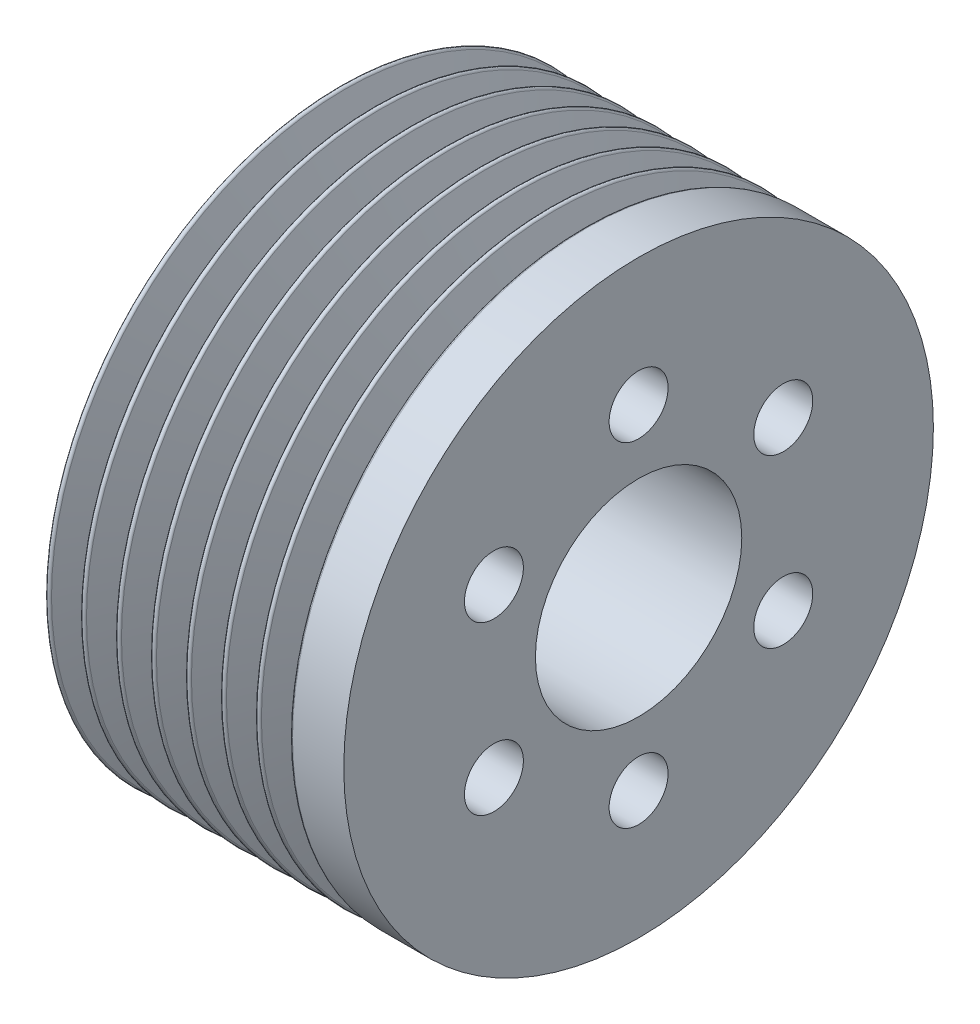
ISO-10303-21;
HEADER;
FILE_DESCRIPTION(('STEP AP214'),'2;1');
FILE_NAME('part.step','',(''),(''),'','','');
FILE_SCHEMA(('AUTOMOTIVE_DESIGN { 1 0 10303 214 1 1 1 1 }'));
ENDSEC;
DATA;
#1=APPLICATION_CONTEXT('core data for automotive mechanical design processes');
#2=APPLICATION_PROTOCOL_DEFINITION('international standard','automotive_design',2000,#1);
#3=PRODUCT_CONTEXT('',#1,'mechanical');
#4=PRODUCT('Part','Part','',(#3));
#5=PRODUCT_RELATED_PRODUCT_CATEGORY('part','',(#4));
#6=PRODUCT_DEFINITION_FORMATION('','',#4);
#7=PRODUCT_DEFINITION_CONTEXT('part definition',#1,'design');
#8=PRODUCT_DEFINITION('design','',#6,#7);
#9=PRODUCT_DEFINITION_SHAPE('','',#8);
#10=(LENGTH_UNIT() NAMED_UNIT(*) SI_UNIT(.MILLI.,.METRE.));
#11=(NAMED_UNIT(*) PLANE_ANGLE_UNIT() SI_UNIT($,.RADIAN.));
#12=(NAMED_UNIT(*) SI_UNIT($,.STERADIAN.) SOLID_ANGLE_UNIT());
#13=UNCERTAINTY_MEASURE_WITH_UNIT(LENGTH_MEASURE(1.E-05),#10,'distance_accuracy_value','');
#14=(GEOMETRIC_REPRESENTATION_CONTEXT(3) GLOBAL_UNCERTAINTY_ASSIGNED_CONTEXT((#13)) GLOBAL_UNIT_ASSIGNED_CONTEXT((#10,
#11,#12)) REPRESENTATION_CONTEXT('',''));
#15=CARTESIAN_POINT('',(0.,0.,0.));
#16=DIRECTION('',(0.,0.,1.));
#17=DIRECTION('',(1.,0.,0.));
#18=AXIS2_PLACEMENT_3D('',#15,#16,#17);
#19=CARTESIAN_POINT('',(18.,30.,0.));
#20=DIRECTION('',(1.,0.,0.));
#21=DIRECTION('',(0.,0.,-1.));
#22=AXIS2_PLACEMENT_3D('',#19,#20,#21);
#23=PLANE('',#22);
#24=CARTESIAN_POINT('',(18.,0.,0.));
#25=DIRECTION('',(-1.,0.,0.));
#26=DIRECTION('',(0.,0.,1.));
#27=AXIS2_PLACEMENT_3D('',#24,#25,#26);
#28=CIRCLE('',#27,21.5);
#29=CARTESIAN_POINT('',(18.,0.,21.5));
#30=VERTEX_POINT('',#29);
#31=EDGE_CURVE('E48',#30,#30,#28,.T.);
#32=ORIENTED_EDGE('',*,*,#31,.F.);
#33=EDGE_LOOP('',(#32));
#34=FACE_BOUND('',#33,.T.);
#35=CARTESIAN_POINT('',(18.,0.,0.));
#36=DIRECTION('',(1.,0.,0.));
#37=DIRECTION('',(0.,0.,-1.));
#38=AXIS2_PLACEMENT_3D('',#35,#36,#37);
#39=CIRCLE('',#38,28.1636882530696);
#40=CARTESIAN_POINT('',(18.,0.,-28.1636882530696));
#41=VERTEX_POINT('',#40);
#42=EDGE_CURVE('E44',#41,#41,#39,.T.);
#43=ORIENTED_EDGE('',*,*,#42,.F.);
#44=EDGE_LOOP('',(#43));
#45=FACE_BOUND('',#44,.T.);
#46=ADVANCED_FACE('F40',(#34,#45),#23,.F.);
#47=CARTESIAN_POINT('',(31.5,10.5,0.));
#48=DIRECTION('',(1.,0.,0.));
#49=DIRECTION('',(0.,0.,-1.));
#50=AXIS2_PLACEMENT_3D('',#47,#48,#49);
#51=PLANE('',#50);
#52=CARTESIAN_POINT('',(31.5,8.50000000000017,14.7224318643354));
#53=DIRECTION('',(1.,0.,0.));
#54=DIRECTION('',(0.,0.,-1.));
#55=AXIS2_PLACEMENT_3D('',#52,#53,#54);
#56=CIRCLE('',#55,3.);
#57=CARTESIAN_POINT('',(31.5,8.50000000000017,11.7224318643354));
#58=VERTEX_POINT('',#57);
#59=EDGE_CURVE('E183',#58,#58,#56,.F.);
#60=ORIENTED_EDGE('',*,*,#59,.F.);
#61=EDGE_LOOP('',(#60));
#62=FACE_BOUND('',#61,.T.);
#63=CARTESIAN_POINT('',(31.5,-8.50000000000004,14.7224318643355));
#64=DIRECTION('',(1.,0.,0.));
#65=DIRECTION('',(0.,0.,-1.));
#66=AXIS2_PLACEMENT_3D('',#63,#64,#65);
#67=CIRCLE('',#66,3.);
#68=CARTESIAN_POINT('',(31.5,-8.50000000000004,11.7224318643355));
#69=VERTEX_POINT('',#68);
#70=EDGE_CURVE('E177',#69,#69,#67,.F.);
#71=ORIENTED_EDGE('',*,*,#70,.F.);
#72=EDGE_LOOP('',(#71));
#73=FACE_BOUND('',#72,.T.);
#74=CARTESIAN_POINT('',(31.5,-17.0000000000001,0.));
#75=DIRECTION('',(1.,0.,0.));
#76=DIRECTION('',(0.,0.,-1.));
#77=AXIS2_PLACEMENT_3D('',#74,#75,#76);
#78=CIRCLE('',#77,3.);
#79=CARTESIAN_POINT('',(31.5,-17.0000000000001,-2.99999999999996));
#80=VERTEX_POINT('',#79);
#81=EDGE_CURVE('E171',#80,#80,#78,.F.);
#82=ORIENTED_EDGE('',*,*,#81,.F.);
#83=EDGE_LOOP('',(#82));
#84=FACE_BOUND('',#83,.T.);
#85=CARTESIAN_POINT('',(31.5,-8.49999999999999,-14.7224318643355));
#86=DIRECTION('',(1.,0.,0.));
#87=DIRECTION('',(0.,0.,-1.));
#88=AXIS2_PLACEMENT_3D('',#85,#86,#87);
#89=CIRCLE('',#88,3.);
#90=CARTESIAN_POINT('',(31.5,-8.49999999999999,-17.7224318643355));
#91=VERTEX_POINT('',#90);
#92=EDGE_CURVE('E165',#91,#91,#89,.F.);
#93=ORIENTED_EDGE('',*,*,#92,.F.);
#94=EDGE_LOOP('',(#93));
#95=FACE_BOUND('',#94,.T.);
#96=CARTESIAN_POINT('',(31.5,8.5,-14.7224318643355));
#97=DIRECTION('',(1.,0.,0.));
#98=DIRECTION('',(0.,0.,-1.));
#99=AXIS2_PLACEMENT_3D('',#96,#97,#98);
#100=CIRCLE('',#99,3.);
#101=CARTESIAN_POINT('',(31.5,8.5,-17.7224318643355));
#102=VERTEX_POINT('',#101);
#103=EDGE_CURVE('E159',#102,#102,#100,.F.);
#104=ORIENTED_EDGE('',*,*,#103,.F.);
#105=EDGE_LOOP('',(#104));
#106=FACE_BOUND('',#105,.T.);
#107=CARTESIAN_POINT('',(31.5,17.,0.));
#108=DIRECTION('',(1.,0.,0.));
#109=DIRECTION('',(0.,0.,-1.));
#110=AXIS2_PLACEMENT_3D('',#107,#108,#109);
#111=CIRCLE('',#110,3.);
#112=CARTESIAN_POINT('',(31.5,17.,-3.));
#113=VERTEX_POINT('',#112);
#114=EDGE_CURVE('E153',#113,#113,#111,.F.);
#115=ORIENTED_EDGE('',*,*,#114,.F.);
#116=EDGE_LOOP('',(#115));
#117=FACE_BOUND('',#116,.T.);
#118=CARTESIAN_POINT('',(31.5,0.,0.));
#119=DIRECTION('',(-1.,0.,0.));
#120=DIRECTION('',(0.,0.,1.));
#121=AXIS2_PLACEMENT_3D('',#118,#119,#120);
#122=CIRCLE('',#121,10.5);
#123=CARTESIAN_POINT('',(31.5,0.,10.5));
#124=VERTEX_POINT('',#123);
#125=EDGE_CURVE('E60',#124,#124,#122,.T.);
#126=ORIENTED_EDGE('',*,*,#125,.F.);
#127=EDGE_LOOP('',(#126));
#128=FACE_BOUND('',#127,.T.);
#129=CARTESIAN_POINT('',(31.5,0.,0.));
#130=DIRECTION('',(-1.,0.,0.));
#131=DIRECTION('',(0.,0.,1.));
#132=AXIS2_PLACEMENT_3D('',#129,#130,#131);
#133=CIRCLE('',#132,21.5);
#134=CARTESIAN_POINT('',(31.5,0.,21.5));
#135=VERTEX_POINT('',#134);
#136=EDGE_CURVE('E10',#135,#135,#133,.T.);
#137=ORIENTED_EDGE('',*,*,#136,.T.);
#138=EDGE_LOOP('',(#137));
#139=FACE_BOUND('',#138,.T.);
#140=ADVANCED_FACE('F42',(#62,#73,#84,#95,#106,#117,#128,#139),#51,.F.);
#141=CARTESIAN_POINT('',(0.,0.,0.));
#142=DIRECTION('',(-1.,0.,0.));
#143=DIRECTION('',(0.,0.,1.));
#144=AXIS2_PLACEMENT_3D('',#141,#142,#143);
#145=CYLINDRICAL_SURFACE('',#144,21.5);
#146=ORIENTED_EDGE('',*,*,#136,.F.);
#147=EDGE_LOOP('',(#146));
#148=FACE_BOUND('',#147,.T.);
#149=ORIENTED_EDGE('',*,*,#31,.T.);
#150=EDGE_LOOP('',(#149));
#151=FACE_BOUND('',#150,.T.);
#152=ADVANCED_FACE('F219',(#148,#151),#145,.F.);
#153=CARTESIAN_POINT('',(0.,0.,0.));
#154=DIRECTION('',(-1.,0.,0.));
#155=DIRECTION('',(0.,0.,1.));
#156=AXIS2_PLACEMENT_3D('',#153,#154,#155);
#157=CYLINDRICAL_SURFACE('',#156,30.);
#158=CARTESIAN_POINT('',(43.78,0.,0.));
#159=DIRECTION('',(-1.,0.,0.));
#160=DIRECTION('',(0.,0.,1.));
#161=AXIS2_PLACEMENT_3D('',#158,#159,#160);
#162=CIRCLE('',#161,30.);
#163=CARTESIAN_POINT('',(43.78,0.,30.));
#164=VERTEX_POINT('',#163);
#165=EDGE_CURVE('E75',#164,#164,#162,.T.);
#166=ORIENTED_EDGE('',*,*,#165,.F.);
#167=EDGE_LOOP('',(#166));
#168=FACE_BOUND('',#167,.T.);
#169=CARTESIAN_POINT('',(49.,0.,0.));
#170=DIRECTION('',(-1.,0.,0.));
#171=DIRECTION('',(0.,0.,1.));
#172=AXIS2_PLACEMENT_3D('',#169,#170,#171);
#173=CIRCLE('',#172,30.);
#174=CARTESIAN_POINT('',(49.,0.,30.));
#175=VERTEX_POINT('',#174);
#176=EDGE_CURVE('E52',#175,#175,#173,.T.);
#177=ORIENTED_EDGE('',*,*,#176,.T.);
#178=EDGE_LOOP('',(#177));
#179=FACE_BOUND('',#178,.T.);
#180=ADVANCED_FACE('F196',(#168,#179),#157,.T.);
#181=CARTESIAN_POINT('',(49.,10.5,0.));
#182=DIRECTION('',(-1.,0.,0.));
#183=DIRECTION('',(0.,0.,1.));
#184=AXIS2_PLACEMENT_3D('',#181,#182,#183);
#185=PLANE('',#184);
#186=CARTESIAN_POINT('',(49.,8.50000000000017,14.7224318643354));
#187=DIRECTION('',(1.,0.,0.));
#188=DIRECTION('',(0.,0.,-1.));
#189=AXIS2_PLACEMENT_3D('',#186,#187,#188);
#190=CIRCLE('',#189,3.);
#191=CARTESIAN_POINT('',(49.,8.50000000000017,11.7224318643354));
#192=VERTEX_POINT('',#191);
#193=EDGE_CURVE('E186',#192,#192,#190,.T.);
#194=ORIENTED_EDGE('',*,*,#193,.F.);
#195=EDGE_LOOP('',(#194));
#196=FACE_BOUND('',#195,.T.);
#197=CARTESIAN_POINT('',(49.,-8.50000000000004,14.7224318643355));
#198=DIRECTION('',(1.,0.,0.));
#199=DIRECTION('',(0.,0.,-1.));
#200=AXIS2_PLACEMENT_3D('',#197,#198,#199);
#201=CIRCLE('',#200,3.);
#202=CARTESIAN_POINT('',(49.,-8.50000000000004,11.7224318643355));
#203=VERTEX_POINT('',#202);
#204=EDGE_CURVE('E180',#203,#203,#201,.T.);
#205=ORIENTED_EDGE('',*,*,#204,.F.);
#206=EDGE_LOOP('',(#205));
#207=FACE_BOUND('',#206,.T.);
#208=CARTESIAN_POINT('',(49.,-17.0000000000001,0.));
#209=DIRECTION('',(1.,0.,0.));
#210=DIRECTION('',(0.,0.,-1.));
#211=AXIS2_PLACEMENT_3D('',#208,#209,#210);
#212=CIRCLE('',#211,3.);
#213=CARTESIAN_POINT('',(49.,-17.0000000000001,-2.99999999999996));
#214=VERTEX_POINT('',#213);
#215=EDGE_CURVE('E174',#214,#214,#212,.T.);
#216=ORIENTED_EDGE('',*,*,#215,.F.);
#217=EDGE_LOOP('',(#216));
#218=FACE_BOUND('',#217,.T.);
#219=CARTESIAN_POINT('',(49.,-8.49999999999999,-14.7224318643355));
#220=DIRECTION('',(1.,0.,0.));
#221=DIRECTION('',(0.,0.,-1.));
#222=AXIS2_PLACEMENT_3D('',#219,#220,#221);
#223=CIRCLE('',#222,3.);
#224=CARTESIAN_POINT('',(49.,-8.49999999999999,-17.7224318643355));
#225=VERTEX_POINT('',#224);
#226=EDGE_CURVE('E168',#225,#225,#223,.T.);
#227=ORIENTED_EDGE('',*,*,#226,.F.);
#228=EDGE_LOOP('',(#227));
#229=FACE_BOUND('',#228,.T.);
#230=CARTESIAN_POINT('',(49.,8.5,-14.7224318643355));
#231=DIRECTION('',(1.,0.,0.));
#232=DIRECTION('',(0.,0.,-1.));
#233=AXIS2_PLACEMENT_3D('',#230,#231,#232);
#234=CIRCLE('',#233,3.);
#235=CARTESIAN_POINT('',(49.,8.5,-17.7224318643355));
#236=VERTEX_POINT('',#235);
#237=EDGE_CURVE('E162',#236,#236,#234,.T.);
#238=ORIENTED_EDGE('',*,*,#237,.F.);
#239=EDGE_LOOP('',(#238));
#240=FACE_BOUND('',#239,.T.);
#241=CARTESIAN_POINT('',(49.,17.,0.));
#242=DIRECTION('',(1.,0.,0.));
#243=DIRECTION('',(0.,0.,-1.));
#244=AXIS2_PLACEMENT_3D('',#241,#242,#243);
#245=CIRCLE('',#244,3.);
#246=CARTESIAN_POINT('',(49.,17.,-3.));
#247=VERTEX_POINT('',#246);
#248=EDGE_CURVE('E156',#247,#247,#245,.T.);
#249=ORIENTED_EDGE('',*,*,#248,.F.);
#250=EDGE_LOOP('',(#249));
#251=FACE_BOUND('',#250,.T.);
#252=ORIENTED_EDGE('',*,*,#176,.F.);
#253=EDGE_LOOP('',(#252));
#254=FACE_BOUND('',#253,.T.);
#255=CARTESIAN_POINT('',(49.,0.,0.));
#256=DIRECTION('',(-1.,0.,0.));
#257=DIRECTION('',(0.,0.,1.));
#258=AXIS2_PLACEMENT_3D('',#255,#256,#257);
#259=CIRCLE('',#258,10.5);
#260=CARTESIAN_POINT('',(49.,0.,10.5));
#261=VERTEX_POINT('',#260);
#262=EDGE_CURVE('E57',#261,#261,#259,.T.);
#263=ORIENTED_EDGE('',*,*,#262,.T.);
#264=EDGE_LOOP('',(#263));
#265=FACE_BOUND('',#264,.T.);
#266=ADVANCED_FACE('F192',(#196,#207,#218,#229,#240,#251,#254,#265),#185,.F.);
#267=CARTESIAN_POINT('',(0.,0.,0.));
#268=DIRECTION('',(-1.,0.,0.));
#269=DIRECTION('',(0.,0.,1.));
#270=AXIS2_PLACEMENT_3D('',#267,#268,#269);
#271=CYLINDRICAL_SURFACE('',#270,10.5);
#272=ORIENTED_EDGE('',*,*,#262,.F.);
#273=EDGE_LOOP('',(#272));
#274=FACE_BOUND('',#273,.T.);
#275=ORIENTED_EDGE('',*,*,#125,.T.);
#276=EDGE_LOOP('',(#275));
#277=FACE_BOUND('',#276,.T.);
#278=ADVANCED_FACE('F195',(#274,#277),#271,.F.);
#279=CARTESIAN_POINT('',(43.78,0.,0.));
#280=DIRECTION('',(-1.,0.,0.));
#281=DIRECTION('',(0.,0.,1.));
#282=AXIS2_PLACEMENT_3D('',#279,#280,#281);
#283=TOROIDAL_SURFACE('',#282,29.75,0.249999999999997);
#284=ORIENTED_EDGE('',*,*,#165,.T.);
#285=EDGE_LOOP('',(#284));
#286=FACE_BOUND('',#285,.T.);
#287=CARTESIAN_POINT('',(43.5458319526879,0.,0.));
#288=DIRECTION('',(-1.,0.,0.));
#289=DIRECTION('',(0.,0.,1.));
#290=AXIS2_PLACEMENT_3D('',#287,#288,#289);
#291=CIRCLE('',#290,29.8375518453149);
#292=CARTESIAN_POINT('',(43.5458319526879,0.,29.8375518453149));
#293=VERTEX_POINT('',#292);
#294=EDGE_CURVE('E63',#293,#293,#291,.T.);
#295=ORIENTED_EDGE('',*,*,#294,.F.);
#296=EDGE_LOOP('',(#295));
#297=FACE_BOUND('',#296,.T.);
#298=ADVANCED_FACE('F214',(#286,#297),#283,.T.);
#299=CARTESIAN_POINT('',(42.2810016567745,0.,0.));
#300=DIRECTION('',(1.,0.,0.));
#301=DIRECTION('',(0.,0.,-1.));
#302=AXIS2_PLACEMENT_3D('',#299,#300,#301);
#303=CONICAL_SURFACE('',#302,26.4546095496951,1.21300383013606);
#304=ORIENTED_EDGE('',*,*,#294,.T.);
#305=EDGE_LOOP('',(#304));
#306=FACE_BOUND('',#305,.T.);
#307=CARTESIAN_POINT('',(42.2810016567745,0.,0.));
#308=DIRECTION('',(-1.,0.,0.));
#309=DIRECTION('',(0.,0.,1.));
#310=AXIS2_PLACEMENT_3D('',#307,#308,#309);
#311=CIRCLE('',#310,26.4546095496951);
#312=CARTESIAN_POINT('',(42.2810016567745,0.,26.4546095496951));
#313=VERTEX_POINT('',#312);
#314=EDGE_CURVE('E66',#313,#313,#311,.T.);
#315=ORIENTED_EDGE('',*,*,#314,.F.);
#316=EDGE_LOOP('',(#315));
#317=FACE_BOUND('',#316,.T.);
#318=ADVANCED_FACE('F364',(#306,#317),#303,.T.);
#319=CARTESIAN_POINT('',(42.,0.,0.));
#320=DIRECTION('',(-1.,0.,0.));
#321=DIRECTION('',(0.,0.,1.));
#322=AXIS2_PLACEMENT_3D('',#319,#320,#321);
#323=TOROIDAL_SURFACE('',#322,26.5596717640729,0.300000000000001);
#324=ORIENTED_EDGE('',*,*,#314,.T.);
#325=EDGE_LOOP('',(#324));
#326=FACE_BOUND('',#325,.T.);
#327=CARTESIAN_POINT('',(41.7189983432255,0.,0.));
#328=DIRECTION('',(-1.,0.,0.));
#329=DIRECTION('',(0.,0.,1.));
#330=AXIS2_PLACEMENT_3D('',#327,#328,#329);
#331=CIRCLE('',#330,26.4546095496951);
#332=CARTESIAN_POINT('',(41.7189983432255,0.,26.4546095496951));
#333=VERTEX_POINT('',#332);
#334=EDGE_CURVE('E69',#333,#333,#331,.T.);
#335=ORIENTED_EDGE('',*,*,#334,.F.);
#336=EDGE_LOOP('',(#335));
#337=FACE_BOUND('',#336,.T.);
#338=ADVANCED_FACE('F360',(#326,#337),#323,.F.);
#339=CARTESIAN_POINT('',(40.4541680473121,0.,0.));
#340=DIRECTION('',(-1.,0.,0.));
#341=DIRECTION('',(0.,0.,1.));
#342=AXIS2_PLACEMENT_3D('',#339,#340,#341);
#343=CONICAL_SURFACE('',#342,29.8375518453149,1.21300383013606);
#344=ORIENTED_EDGE('',*,*,#334,.T.);
#345=EDGE_LOOP('',(#344));
#346=FACE_BOUND('',#345,.T.);
#347=CARTESIAN_POINT('',(40.4541680473121,0.,0.));
#348=DIRECTION('',(-1.,0.,0.));
#349=DIRECTION('',(0.,0.,1.));
#350=AXIS2_PLACEMENT_3D('',#347,#348,#349);
#351=CIRCLE('',#350,29.8375518453149);
#352=CARTESIAN_POINT('',(40.4541680473121,0.,29.8375518453149));
#353=VERTEX_POINT('',#352);
#354=EDGE_CURVE('E72',#353,#353,#351,.T.);
#355=ORIENTED_EDGE('',*,*,#354,.F.);
#356=EDGE_LOOP('',(#355));
#357=FACE_BOUND('',#356,.T.);
#358=ADVANCED_FACE('F356',(#346,#357),#343,.T.);
#359=CARTESIAN_POINT('',(40.22,0.,0.));
#360=DIRECTION('',(-1.,0.,0.));
#361=DIRECTION('',(0.,0.,1.));
#362=AXIS2_PLACEMENT_3D('',#359,#360,#361);
#363=TOROIDAL_SURFACE('',#362,29.75,0.250000000000004);
#364=ORIENTED_EDGE('',*,*,#354,.T.);
#365=EDGE_LOOP('',(#364));
#366=FACE_BOUND('',#365,.T.);
#367=CARTESIAN_POINT('',(39.9858319526879,0.,0.));
#368=DIRECTION('',(-1.,0.,0.));
#369=DIRECTION('',(0.,0.,1.));
#370=AXIS2_PLACEMENT_3D('',#367,#368,#369);
#371=CIRCLE('',#370,29.8375518453149);
#372=CARTESIAN_POINT('',(39.9858319526879,0.,29.8375518453149));
#373=VERTEX_POINT('',#372);
#374=EDGE_CURVE('E78',#373,#373,#371,.T.);
#375=ORIENTED_EDGE('',*,*,#374,.F.);
#376=EDGE_LOOP('',(#375));
#377=FACE_BOUND('',#376,.T.);
#378=ADVANCED_FACE('F352',(#366,#377),#363,.T.);
#379=CARTESIAN_POINT('',(38.7210016567745,0.,0.));
#380=DIRECTION('',(1.,0.,0.));
#381=DIRECTION('',(0.,0.,-1.));
#382=AXIS2_PLACEMENT_3D('',#379,#380,#381);
#383=CONICAL_SURFACE('',#382,26.4546095496951,1.21300383013606);
#384=ORIENTED_EDGE('',*,*,#374,.T.);
#385=EDGE_LOOP('',(#384));
#386=FACE_BOUND('',#385,.T.);
#387=CARTESIAN_POINT('',(38.7210016567745,0.,0.));
#388=DIRECTION('',(-1.,0.,0.));
#389=DIRECTION('',(0.,0.,1.));
#390=AXIS2_PLACEMENT_3D('',#387,#388,#389);
#391=CIRCLE('',#390,26.4546095496951);
#392=CARTESIAN_POINT('',(38.7210016567745,0.,26.4546095496951));
#393=VERTEX_POINT('',#392);
#394=EDGE_CURVE('E81',#393,#393,#391,.T.);
#395=ORIENTED_EDGE('',*,*,#394,.F.);
#396=EDGE_LOOP('',(#395));
#397=FACE_BOUND('',#396,.T.);
#398=ADVANCED_FACE('F348',(#386,#397),#383,.T.);
#399=CARTESIAN_POINT('',(38.44,0.,0.));
#400=DIRECTION('',(-1.,0.,0.));
#401=DIRECTION('',(0.,0.,1.));
#402=AXIS2_PLACEMENT_3D('',#399,#400,#401);
#403=TOROIDAL_SURFACE('',#402,26.5596717640729,0.300000000000001);
#404=ORIENTED_EDGE('',*,*,#394,.T.);
#405=EDGE_LOOP('',(#404));
#406=FACE_BOUND('',#405,.T.);
#407=CARTESIAN_POINT('',(38.1589983432255,0.,0.));
#408=DIRECTION('',(-1.,0.,0.));
#409=DIRECTION('',(0.,0.,1.));
#410=AXIS2_PLACEMENT_3D('',#407,#408,#409);
#411=CIRCLE('',#410,26.4546095496951);
#412=CARTESIAN_POINT('',(38.1589983432255,0.,26.4546095496951));
#413=VERTEX_POINT('',#412);
#414=EDGE_CURVE('E84',#413,#413,#411,.T.);
#415=ORIENTED_EDGE('',*,*,#414,.F.);
#416=EDGE_LOOP('',(#415));
#417=FACE_BOUND('',#416,.T.);
#418=ADVANCED_FACE('F344',(#406,#417),#403,.F.);
#419=CARTESIAN_POINT('',(36.8941680473121,0.,0.));
#420=DIRECTION('',(-1.,0.,0.));
#421=DIRECTION('',(0.,0.,1.));
#422=AXIS2_PLACEMENT_3D('',#419,#420,#421);
#423=CONICAL_SURFACE('',#422,29.8375518453149,1.21300383013606);
#424=ORIENTED_EDGE('',*,*,#414,.T.);
#425=EDGE_LOOP('',(#424));
#426=FACE_BOUND('',#425,.T.);
#427=CARTESIAN_POINT('',(36.8941680473121,0.,0.));
#428=DIRECTION('',(-1.,0.,0.));
#429=DIRECTION('',(0.,0.,1.));
#430=AXIS2_PLACEMENT_3D('',#427,#428,#429);
#431=CIRCLE('',#430,29.8375518453149);
#432=CARTESIAN_POINT('',(36.8941680473121,0.,29.8375518453149));
#433=VERTEX_POINT('',#432);
#434=EDGE_CURVE('E87',#433,#433,#431,.T.);
#435=ORIENTED_EDGE('',*,*,#434,.F.);
#436=EDGE_LOOP('',(#435));
#437=FACE_BOUND('',#436,.T.);
#438=ADVANCED_FACE('F340',(#426,#437),#423,.T.);
#439=CARTESIAN_POINT('',(36.66,0.,0.));
#440=DIRECTION('',(-1.,0.,0.));
#441=DIRECTION('',(0.,0.,1.));
#442=AXIS2_PLACEMENT_3D('',#439,#440,#441);
#443=TOROIDAL_SURFACE('',#442,29.75,0.250000000000004);
#444=ORIENTED_EDGE('',*,*,#434,.T.);
#445=EDGE_LOOP('',(#444));
#446=FACE_BOUND('',#445,.T.);
#447=CARTESIAN_POINT('',(36.4258319526879,0.,0.));
#448=DIRECTION('',(-1.,0.,0.));
#449=DIRECTION('',(0.,0.,1.));
#450=AXIS2_PLACEMENT_3D('',#447,#448,#449);
#451=CIRCLE('',#450,29.8375518453149);
#452=CARTESIAN_POINT('',(36.4258319526879,0.,29.8375518453149));
#453=VERTEX_POINT('',#452);
#454=EDGE_CURVE('E90',#453,#453,#451,.T.);
#455=ORIENTED_EDGE('',*,*,#454,.F.);
#456=EDGE_LOOP('',(#455));
#457=FACE_BOUND('',#456,.T.);
#458=ADVANCED_FACE('F336',(#446,#457),#443,.T.);
#459=CARTESIAN_POINT('',(35.1610016567745,0.,0.));
#460=DIRECTION('',(1.,0.,0.));
#461=DIRECTION('',(0.,0.,-1.));
#462=AXIS2_PLACEMENT_3D('',#459,#460,#461);
#463=CONICAL_SURFACE('',#462,26.4546095496951,1.21300383013606);
#464=ORIENTED_EDGE('',*,*,#454,.T.);
#465=EDGE_LOOP('',(#464));
#466=FACE_BOUND('',#465,.T.);
#467=CARTESIAN_POINT('',(35.1610016567745,0.,0.));
#468=DIRECTION('',(-1.,0.,0.));
#469=DIRECTION('',(0.,0.,1.));
#470=AXIS2_PLACEMENT_3D('',#467,#468,#469);
#471=CIRCLE('',#470,26.4546095496951);
#472=CARTESIAN_POINT('',(35.1610016567745,0.,26.4546095496951));
#473=VERTEX_POINT('',#472);
#474=EDGE_CURVE('E93',#473,#473,#471,.T.);
#475=ORIENTED_EDGE('',*,*,#474,.F.);
#476=EDGE_LOOP('',(#475));
#477=FACE_BOUND('',#476,.T.);
#478=ADVANCED_FACE('F332',(#466,#477),#463,.T.);
#479=CARTESIAN_POINT('',(34.88,0.,0.));
#480=DIRECTION('',(-1.,0.,0.));
#481=DIRECTION('',(0.,0.,1.));
#482=AXIS2_PLACEMENT_3D('',#479,#480,#481);
#483=TOROIDAL_SURFACE('',#482,26.5596717640729,0.300000000000001);
#484=ORIENTED_EDGE('',*,*,#474,.T.);
#485=EDGE_LOOP('',(#484));
#486=FACE_BOUND('',#485,.T.);
#487=CARTESIAN_POINT('',(34.5989983432255,0.,0.));
#488=DIRECTION('',(-1.,0.,0.));
#489=DIRECTION('',(0.,0.,1.));
#490=AXIS2_PLACEMENT_3D('',#487,#488,#489);
#491=CIRCLE('',#490,26.4546095496951);
#492=CARTESIAN_POINT('',(34.5989983432255,0.,26.4546095496951));
#493=VERTEX_POINT('',#492);
#494=EDGE_CURVE('E96',#493,#493,#491,.T.);
#495=ORIENTED_EDGE('',*,*,#494,.F.);
#496=EDGE_LOOP('',(#495));
#497=FACE_BOUND('',#496,.T.);
#498=ADVANCED_FACE('F328',(#486,#497),#483,.F.);
#499=CARTESIAN_POINT('',(33.3341680473121,0.,0.));
#500=DIRECTION('',(-1.,0.,0.));
#501=DIRECTION('',(0.,0.,1.));
#502=AXIS2_PLACEMENT_3D('',#499,#500,#501);
#503=CONICAL_SURFACE('',#502,29.8375518453149,1.21300383013606);
#504=ORIENTED_EDGE('',*,*,#494,.T.);
#505=EDGE_LOOP('',(#504));
#506=FACE_BOUND('',#505,.T.);
#507=CARTESIAN_POINT('',(33.3341680473121,0.,0.));
#508=DIRECTION('',(-1.,0.,0.));
#509=DIRECTION('',(0.,0.,1.));
#510=AXIS2_PLACEMENT_3D('',#507,#508,#509);
#511=CIRCLE('',#510,29.8375518453149);
#512=CARTESIAN_POINT('',(33.3341680473121,0.,29.8375518453149));
#513=VERTEX_POINT('',#512);
#514=EDGE_CURVE('E99',#513,#513,#511,.T.);
#515=ORIENTED_EDGE('',*,*,#514,.F.);
#516=EDGE_LOOP('',(#515));
#517=FACE_BOUND('',#516,.T.);
#518=ADVANCED_FACE('F324',(#506,#517),#503,.T.);
#519=CARTESIAN_POINT('',(33.1,0.,0.));
#520=DIRECTION('',(-1.,0.,0.));
#521=DIRECTION('',(0.,0.,1.));
#522=AXIS2_PLACEMENT_3D('',#519,#520,#521);
#523=TOROIDAL_SURFACE('',#522,29.75,0.250000000000004);
#524=ORIENTED_EDGE('',*,*,#514,.T.);
#525=EDGE_LOOP('',(#524));
#526=FACE_BOUND('',#525,.T.);
#527=CARTESIAN_POINT('',(32.8658319526879,0.,0.));
#528=DIRECTION('',(-1.,0.,0.));
#529=DIRECTION('',(0.,0.,1.));
#530=AXIS2_PLACEMENT_3D('',#527,#528,#529);
#531=CIRCLE('',#530,29.8375518453149);
#532=CARTESIAN_POINT('',(32.8658319526879,0.,29.8375518453149));
#533=VERTEX_POINT('',#532);
#534=EDGE_CURVE('E102',#533,#533,#531,.T.);
#535=ORIENTED_EDGE('',*,*,#534,.F.);
#536=EDGE_LOOP('',(#535));
#537=FACE_BOUND('',#536,.T.);
#538=ADVANCED_FACE('F320',(#526,#537),#523,.T.);
#539=CARTESIAN_POINT('',(31.6010016567745,0.,0.));
#540=DIRECTION('',(1.,0.,0.));
#541=DIRECTION('',(0.,0.,-1.));
#542=AXIS2_PLACEMENT_3D('',#539,#540,#541);
#543=CONICAL_SURFACE('',#542,26.4546095496951,1.21300383013606);
#544=ORIENTED_EDGE('',*,*,#534,.T.);
#545=EDGE_LOOP('',(#544));
#546=FACE_BOUND('',#545,.T.);
#547=CARTESIAN_POINT('',(31.6010016567745,0.,0.));
#548=DIRECTION('',(-1.,0.,0.));
#549=DIRECTION('',(0.,0.,1.));
#550=AXIS2_PLACEMENT_3D('',#547,#548,#549);
#551=CIRCLE('',#550,26.4546095496951);
#552=CARTESIAN_POINT('',(31.6010016567745,0.,26.4546095496951));
#553=VERTEX_POINT('',#552);
#554=EDGE_CURVE('E105',#553,#553,#551,.T.);
#555=ORIENTED_EDGE('',*,*,#554,.F.);
#556=EDGE_LOOP('',(#555));
#557=FACE_BOUND('',#556,.T.);
#558=ADVANCED_FACE('F316',(#546,#557),#543,.T.);
#559=CARTESIAN_POINT('',(31.32,0.,0.));
#560=DIRECTION('',(-1.,0.,0.));
#561=DIRECTION('',(0.,0.,1.));
#562=AXIS2_PLACEMENT_3D('',#559,#560,#561);
#563=TOROIDAL_SURFACE('',#562,26.5596717640729,0.300000000000001);
#564=ORIENTED_EDGE('',*,*,#554,.T.);
#565=EDGE_LOOP('',(#564));
#566=FACE_BOUND('',#565,.T.);
#567=CARTESIAN_POINT('',(31.0389983432255,0.,0.));
#568=DIRECTION('',(-1.,0.,0.));
#569=DIRECTION('',(0.,0.,1.));
#570=AXIS2_PLACEMENT_3D('',#567,#568,#569);
#571=CIRCLE('',#570,26.4546095496951);
#572=CARTESIAN_POINT('',(31.0389983432255,0.,26.4546095496951));
#573=VERTEX_POINT('',#572);
#574=EDGE_CURVE('E108',#573,#573,#571,.T.);
#575=ORIENTED_EDGE('',*,*,#574,.F.);
#576=EDGE_LOOP('',(#575));
#577=FACE_BOUND('',#576,.T.);
#578=ADVANCED_FACE('F312',(#566,#577),#563,.F.);
#579=CARTESIAN_POINT('',(29.7741680473121,0.,0.));
#580=DIRECTION('',(-1.,0.,0.));
#581=DIRECTION('',(0.,0.,1.));
#582=AXIS2_PLACEMENT_3D('',#579,#580,#581);
#583=CONICAL_SURFACE('',#582,29.8375518453149,1.21300383013606);
#584=ORIENTED_EDGE('',*,*,#574,.T.);
#585=EDGE_LOOP('',(#584));
#586=FACE_BOUND('',#585,.T.);
#587=CARTESIAN_POINT('',(29.7741680473121,0.,0.));
#588=DIRECTION('',(-1.,0.,0.));
#589=DIRECTION('',(0.,0.,1.));
#590=AXIS2_PLACEMENT_3D('',#587,#588,#589);
#591=CIRCLE('',#590,29.8375518453149);
#592=CARTESIAN_POINT('',(29.7741680473121,0.,29.8375518453149));
#593=VERTEX_POINT('',#592);
#594=EDGE_CURVE('E111',#593,#593,#591,.T.);
#595=ORIENTED_EDGE('',*,*,#594,.F.);
#596=EDGE_LOOP('',(#595));
#597=FACE_BOUND('',#596,.T.);
#598=ADVANCED_FACE('F308',(#586,#597),#583,.T.);
#599=CARTESIAN_POINT('',(29.54,0.,0.));
#600=DIRECTION('',(-1.,0.,0.));
#601=DIRECTION('',(0.,0.,1.));
#602=AXIS2_PLACEMENT_3D('',#599,#600,#601);
#603=TOROIDAL_SURFACE('',#602,29.75,0.250000000000004);
#604=ORIENTED_EDGE('',*,*,#594,.T.);
#605=EDGE_LOOP('',(#604));
#606=FACE_BOUND('',#605,.T.);
#607=CARTESIAN_POINT('',(29.3058319526879,0.,0.));
#608=DIRECTION('',(-1.,0.,0.));
#609=DIRECTION('',(0.,0.,1.));
#610=AXIS2_PLACEMENT_3D('',#607,#608,#609);
#611=CIRCLE('',#610,29.8375518453149);
#612=CARTESIAN_POINT('',(29.3058319526879,0.,29.8375518453149));
#613=VERTEX_POINT('',#612);
#614=EDGE_CURVE('E114',#613,#613,#611,.T.);
#615=ORIENTED_EDGE('',*,*,#614,.F.);
#616=EDGE_LOOP('',(#615));
#617=FACE_BOUND('',#616,.T.);
#618=ADVANCED_FACE('F304',(#606,#617),#603,.T.);
#619=CARTESIAN_POINT('',(28.0410016567745,0.,0.));
#620=DIRECTION('',(1.,0.,0.));
#621=DIRECTION('',(0.,0.,-1.));
#622=AXIS2_PLACEMENT_3D('',#619,#620,#621);
#623=CONICAL_SURFACE('',#622,26.4546095496951,1.21300383013606);
#624=ORIENTED_EDGE('',*,*,#614,.T.);
#625=EDGE_LOOP('',(#624));
#626=FACE_BOUND('',#625,.T.);
#627=CARTESIAN_POINT('',(28.0410016567745,0.,0.));
#628=DIRECTION('',(-1.,0.,0.));
#629=DIRECTION('',(0.,0.,1.));
#630=AXIS2_PLACEMENT_3D('',#627,#628,#629);
#631=CIRCLE('',#630,26.4546095496951);
#632=CARTESIAN_POINT('',(28.0410016567745,0.,26.4546095496951));
#633=VERTEX_POINT('',#632);
#634=EDGE_CURVE('E117',#633,#633,#631,.T.);
#635=ORIENTED_EDGE('',*,*,#634,.F.);
#636=EDGE_LOOP('',(#635));
#637=FACE_BOUND('',#636,.T.);
#638=ADVANCED_FACE('F300',(#626,#637),#623,.T.);
#639=CARTESIAN_POINT('',(27.76,0.,0.));
#640=DIRECTION('',(-1.,0.,0.));
#641=DIRECTION('',(0.,0.,1.));
#642=AXIS2_PLACEMENT_3D('',#639,#640,#641);
#643=TOROIDAL_SURFACE('',#642,26.5596717640729,0.300000000000001);
#644=ORIENTED_EDGE('',*,*,#634,.T.);
#645=EDGE_LOOP('',(#644));
#646=FACE_BOUND('',#645,.T.);
#647=CARTESIAN_POINT('',(27.4789983432255,0.,0.));
#648=DIRECTION('',(-1.,0.,0.));
#649=DIRECTION('',(0.,0.,1.));
#650=AXIS2_PLACEMENT_3D('',#647,#648,#649);
#651=CIRCLE('',#650,26.4546095496951);
#652=CARTESIAN_POINT('',(27.4789983432255,0.,26.4546095496951));
#653=VERTEX_POINT('',#652);
#654=EDGE_CURVE('E120',#653,#653,#651,.T.);
#655=ORIENTED_EDGE('',*,*,#654,.F.);
#656=EDGE_LOOP('',(#655));
#657=FACE_BOUND('',#656,.T.);
#658=ADVANCED_FACE('F296',(#646,#657),#643,.F.);
#659=CARTESIAN_POINT('',(26.2141680473121,0.,0.));
#660=DIRECTION('',(-1.,0.,0.));
#661=DIRECTION('',(0.,0.,1.));
#662=AXIS2_PLACEMENT_3D('',#659,#660,#661);
#663=CONICAL_SURFACE('',#662,29.8375518453149,1.21300383013606);
#664=ORIENTED_EDGE('',*,*,#654,.T.);
#665=EDGE_LOOP('',(#664));
#666=FACE_BOUND('',#665,.T.);
#667=CARTESIAN_POINT('',(26.2141680473121,0.,0.));
#668=DIRECTION('',(-1.,0.,0.));
#669=DIRECTION('',(0.,0.,1.));
#670=AXIS2_PLACEMENT_3D('',#667,#668,#669);
#671=CIRCLE('',#670,29.8375518453149);
#672=CARTESIAN_POINT('',(26.2141680473121,0.,29.8375518453149));
#673=VERTEX_POINT('',#672);
#674=EDGE_CURVE('E123',#673,#673,#671,.T.);
#675=ORIENTED_EDGE('',*,*,#674,.F.);
#676=EDGE_LOOP('',(#675));
#677=FACE_BOUND('',#676,.T.);
#678=ADVANCED_FACE('F292',(#666,#677),#663,.T.);
#679=CARTESIAN_POINT('',(25.98,0.,0.));
#680=DIRECTION('',(-1.,0.,0.));
#681=DIRECTION('',(0.,0.,1.));
#682=AXIS2_PLACEMENT_3D('',#679,#680,#681);
#683=TOROIDAL_SURFACE('',#682,29.75,0.250000000000004);
#684=ORIENTED_EDGE('',*,*,#674,.T.);
#685=EDGE_LOOP('',(#684));
#686=FACE_BOUND('',#685,.T.);
#687=CARTESIAN_POINT('',(25.7458319526879,0.,0.));
#688=DIRECTION('',(-1.,0.,0.));
#689=DIRECTION('',(0.,0.,1.));
#690=AXIS2_PLACEMENT_3D('',#687,#688,#689);
#691=CIRCLE('',#690,29.8375518453149);
#692=CARTESIAN_POINT('',(25.7458319526879,0.,29.8375518453149));
#693=VERTEX_POINT('',#692);
#694=EDGE_CURVE('E126',#693,#693,#691,.T.);
#695=ORIENTED_EDGE('',*,*,#694,.F.);
#696=EDGE_LOOP('',(#695));
#697=FACE_BOUND('',#696,.T.);
#698=ADVANCED_FACE('F288',(#686,#697),#683,.T.);
#699=CARTESIAN_POINT('',(24.4810016567745,0.,0.));
#700=DIRECTION('',(1.,0.,0.));
#701=DIRECTION('',(0.,0.,-1.));
#702=AXIS2_PLACEMENT_3D('',#699,#700,#701);
#703=CONICAL_SURFACE('',#702,26.4546095496951,1.21300383013606);
#704=ORIENTED_EDGE('',*,*,#694,.T.);
#705=EDGE_LOOP('',(#704));
#706=FACE_BOUND('',#705,.T.);
#707=CARTESIAN_POINT('',(24.4810016567745,0.,0.));
#708=DIRECTION('',(-1.,0.,0.));
#709=DIRECTION('',(0.,0.,1.));
#710=AXIS2_PLACEMENT_3D('',#707,#708,#709);
#711=CIRCLE('',#710,26.4546095496951);
#712=CARTESIAN_POINT('',(24.4810016567745,0.,26.4546095496951));
#713=VERTEX_POINT('',#712);
#714=EDGE_CURVE('E129',#713,#713,#711,.T.);
#715=ORIENTED_EDGE('',*,*,#714,.F.);
#716=EDGE_LOOP('',(#715));
#717=FACE_BOUND('',#716,.T.);
#718=ADVANCED_FACE('F284',(#706,#717),#703,.T.);
#719=CARTESIAN_POINT('',(24.2,0.,0.));
#720=DIRECTION('',(-1.,0.,0.));
#721=DIRECTION('',(0.,0.,1.));
#722=AXIS2_PLACEMENT_3D('',#719,#720,#721);
#723=TOROIDAL_SURFACE('',#722,26.5596717640729,0.300000000000001);
#724=ORIENTED_EDGE('',*,*,#714,.T.);
#725=EDGE_LOOP('',(#724));
#726=FACE_BOUND('',#725,.T.);
#727=CARTESIAN_POINT('',(23.9189983432255,0.,0.));
#728=DIRECTION('',(-1.,0.,0.));
#729=DIRECTION('',(0.,0.,1.));
#730=AXIS2_PLACEMENT_3D('',#727,#728,#729);
#731=CIRCLE('',#730,26.4546095496951);
#732=CARTESIAN_POINT('',(23.9189983432255,0.,26.4546095496951));
#733=VERTEX_POINT('',#732);
#734=EDGE_CURVE('E132',#733,#733,#731,.T.);
#735=ORIENTED_EDGE('',*,*,#734,.F.);
#736=EDGE_LOOP('',(#735));
#737=FACE_BOUND('',#736,.T.);
#738=ADVANCED_FACE('F280',(#726,#737),#723,.F.);
#739=CARTESIAN_POINT('',(22.6541680473121,0.,0.));
#740=DIRECTION('',(-1.,0.,0.));
#741=DIRECTION('',(0.,0.,1.));
#742=AXIS2_PLACEMENT_3D('',#739,#740,#741);
#743=CONICAL_SURFACE('',#742,29.8375518453149,1.21300383013606);
#744=ORIENTED_EDGE('',*,*,#734,.T.);
#745=EDGE_LOOP('',(#744));
#746=FACE_BOUND('',#745,.T.);
#747=CARTESIAN_POINT('',(22.6541680473121,0.,0.));
#748=DIRECTION('',(-1.,0.,0.));
#749=DIRECTION('',(0.,0.,1.));
#750=AXIS2_PLACEMENT_3D('',#747,#748,#749);
#751=CIRCLE('',#750,29.8375518453149);
#752=CARTESIAN_POINT('',(22.6541680473121,0.,29.8375518453149));
#753=VERTEX_POINT('',#752);
#754=EDGE_CURVE('E135',#753,#753,#751,.T.);
#755=ORIENTED_EDGE('',*,*,#754,.F.);
#756=EDGE_LOOP('',(#755));
#757=FACE_BOUND('',#756,.T.);
#758=ADVANCED_FACE('F276',(#746,#757),#743,.T.);
#759=CARTESIAN_POINT('',(22.42,0.,0.));
#760=DIRECTION('',(-1.,0.,0.));
#761=DIRECTION('',(0.,0.,1.));
#762=AXIS2_PLACEMENT_3D('',#759,#760,#761);
#763=TOROIDAL_SURFACE('',#762,29.75,0.250000000000004);
#764=ORIENTED_EDGE('',*,*,#754,.T.);
#765=EDGE_LOOP('',(#764));
#766=FACE_BOUND('',#765,.T.);
#767=CARTESIAN_POINT('',(22.1858319526879,0.,0.));
#768=DIRECTION('',(-1.,0.,0.));
#769=DIRECTION('',(0.,0.,1.));
#770=AXIS2_PLACEMENT_3D('',#767,#768,#769);
#771=CIRCLE('',#770,29.8375518453149);
#772=CARTESIAN_POINT('',(22.1858319526879,0.,29.8375518453149));
#773=VERTEX_POINT('',#772);
#774=EDGE_CURVE('E138',#773,#773,#771,.T.);
#775=ORIENTED_EDGE('',*,*,#774,.F.);
#776=EDGE_LOOP('',(#775));
#777=FACE_BOUND('',#776,.T.);
#778=ADVANCED_FACE('F272',(#766,#777),#763,.T.);
#779=CARTESIAN_POINT('',(20.9210016567745,0.,0.));
#780=DIRECTION('',(1.,0.,0.));
#781=DIRECTION('',(0.,0.,-1.));
#782=AXIS2_PLACEMENT_3D('',#779,#780,#781);
#783=CONICAL_SURFACE('',#782,26.4546095496951,1.21300383013606);
#784=ORIENTED_EDGE('',*,*,#774,.T.);
#785=EDGE_LOOP('',(#784));
#786=FACE_BOUND('',#785,.T.);
#787=CARTESIAN_POINT('',(20.9210016567745,0.,0.));
#788=DIRECTION('',(-1.,0.,0.));
#789=DIRECTION('',(0.,0.,1.));
#790=AXIS2_PLACEMENT_3D('',#787,#788,#789);
#791=CIRCLE('',#790,26.4546095496951);
#792=CARTESIAN_POINT('',(20.9210016567745,0.,26.4546095496951));
#793=VERTEX_POINT('',#792);
#794=EDGE_CURVE('E141',#793,#793,#791,.T.);
#795=ORIENTED_EDGE('',*,*,#794,.F.);
#796=EDGE_LOOP('',(#795));
#797=FACE_BOUND('',#796,.T.);
#798=ADVANCED_FACE('F268',(#786,#797),#783,.T.);
#799=CARTESIAN_POINT('',(20.64,0.,0.));
#800=DIRECTION('',(-1.,0.,0.));
#801=DIRECTION('',(0.,0.,1.));
#802=AXIS2_PLACEMENT_3D('',#799,#800,#801);
#803=TOROIDAL_SURFACE('',#802,26.5596717640729,0.300000000000001);
#804=ORIENTED_EDGE('',*,*,#794,.T.);
#805=EDGE_LOOP('',(#804));
#806=FACE_BOUND('',#805,.T.);
#807=CARTESIAN_POINT('',(20.3589983432255,0.,0.));
#808=DIRECTION('',(-1.,0.,0.));
#809=DIRECTION('',(0.,0.,1.));
#810=AXIS2_PLACEMENT_3D('',#807,#808,#809);
#811=CIRCLE('',#810,26.4546095496951);
#812=CARTESIAN_POINT('',(20.3589983432255,0.,26.4546095496951));
#813=VERTEX_POINT('',#812);
#814=EDGE_CURVE('E144',#813,#813,#811,.T.);
#815=ORIENTED_EDGE('',*,*,#814,.F.);
#816=EDGE_LOOP('',(#815));
#817=FACE_BOUND('',#816,.T.);
#818=ADVANCED_FACE('F264',(#806,#817),#803,.F.);
#819=CARTESIAN_POINT('',(19.0941680473121,0.,0.));
#820=DIRECTION('',(-1.,0.,0.));
#821=DIRECTION('',(0.,0.,1.));
#822=AXIS2_PLACEMENT_3D('',#819,#820,#821);
#823=CONICAL_SURFACE('',#822,29.8375518453149,1.21300383013606);
#824=ORIENTED_EDGE('',*,*,#814,.T.);
#825=EDGE_LOOP('',(#824));
#826=FACE_BOUND('',#825,.T.);
#827=CARTESIAN_POINT('',(19.0941680473121,0.,0.));
#828=DIRECTION('',(-1.,0.,0.));
#829=DIRECTION('',(0.,0.,1.));
#830=AXIS2_PLACEMENT_3D('',#827,#828,#829);
#831=CIRCLE('',#830,29.8375518453149);
#832=CARTESIAN_POINT('',(19.0941680473121,0.,29.8375518453149));
#833=VERTEX_POINT('',#832);
#834=EDGE_CURVE('E147',#833,#833,#831,.T.);
#835=ORIENTED_EDGE('',*,*,#834,.F.);
#836=EDGE_LOOP('',(#835));
#837=FACE_BOUND('',#836,.T.);
#838=ADVANCED_FACE('F260',(#826,#837),#823,.T.);
#839=CARTESIAN_POINT('',(18.86,0.,0.));
#840=DIRECTION('',(-1.,0.,0.));
#841=DIRECTION('',(0.,0.,1.));
#842=AXIS2_PLACEMENT_3D('',#839,#840,#841);
#843=TOROIDAL_SURFACE('',#842,29.75,0.250000000000004);
#844=ORIENTED_EDGE('',*,*,#834,.T.);
#845=EDGE_LOOP('',(#844));
#846=FACE_BOUND('',#845,.T.);
#847=CARTESIAN_POINT('',(18.6258319526879,0.,0.));
#848=DIRECTION('',(-1.,0.,0.));
#849=DIRECTION('',(0.,0.,1.));
#850=AXIS2_PLACEMENT_3D('',#847,#848,#849);
#851=CIRCLE('',#850,29.8375518453149);
#852=CARTESIAN_POINT('',(18.6258319526879,0.,29.8375518453149));
#853=VERTEX_POINT('',#852);
#854=EDGE_CURVE('E150',#853,#853,#851,.T.);
#855=ORIENTED_EDGE('',*,*,#854,.F.);
#856=EDGE_LOOP('',(#855));
#857=FACE_BOUND('',#856,.T.);
#858=ADVANCED_FACE('F253',(#846,#857),#843,.T.);
#859=CARTESIAN_POINT('',(17.3610016567745,0.,0.));
#860=DIRECTION('',(1.,0.,0.));
#861=DIRECTION('',(0.,0.,-1.));
#862=AXIS2_PLACEMENT_3D('',#859,#860,#861);
#863=CONICAL_SURFACE('',#862,26.4546095496951,1.21300383013606);
#864=ORIENTED_EDGE('',*,*,#854,.T.);
#865=EDGE_LOOP('',(#864));
#866=FACE_BOUND('',#865,.T.);
#867=ORIENTED_EDGE('',*,*,#42,.T.);
#868=EDGE_LOOP('',(#867));
#869=FACE_BOUND('',#868,.T.);
#870=ADVANCED_FACE('F244',(#866,#869),#863,.T.);
#871=CARTESIAN_POINT('',(23.0147186257614,17.,0.));
#872=DIRECTION('',(1.,0.,0.));
#873=DIRECTION('',(0.,0.,-1.));
#874=AXIS2_PLACEMENT_3D('',#871,#872,#873);
#875=CYLINDRICAL_SURFACE('',#874,3.);
#876=ORIENTED_EDGE('',*,*,#114,.T.);
#877=EDGE_LOOP('',(#876));
#878=FACE_BOUND('',#877,.T.);
#879=ORIENTED_EDGE('',*,*,#248,.T.);
#880=EDGE_LOOP('',(#879));
#881=FACE_BOUND('',#880,.T.);
#882=ADVANCED_FACE('F240',(#878,#881),#875,.F.);
#883=CARTESIAN_POINT('',(23.0147186257614,8.5,-14.7224318643355));
#884=DIRECTION('',(1.,0.,0.));
#885=DIRECTION('',(0.,0.,-1.));
#886=AXIS2_PLACEMENT_3D('',#883,#884,#885);
#887=CYLINDRICAL_SURFACE('',#886,3.);
#888=ORIENTED_EDGE('',*,*,#103,.T.);
#889=EDGE_LOOP('',(#888));
#890=FACE_BOUND('',#889,.T.);
#891=ORIENTED_EDGE('',*,*,#237,.T.);
#892=EDGE_LOOP('',(#891));
#893=FACE_BOUND('',#892,.T.);
#894=ADVANCED_FACE('F243',(#890,#893),#887,.F.);
#895=CARTESIAN_POINT('',(23.0147186257614,-8.49999999999999,-14.7224318643355));
#896=DIRECTION('',(1.,0.,0.));
#897=DIRECTION('',(0.,0.,-1.));
#898=AXIS2_PLACEMENT_3D('',#895,#896,#897);
#899=CYLINDRICAL_SURFACE('',#898,3.);
#900=ORIENTED_EDGE('',*,*,#92,.T.);
#901=EDGE_LOOP('',(#900));
#902=FACE_BOUND('',#901,.T.);
#903=ORIENTED_EDGE('',*,*,#226,.T.);
#904=EDGE_LOOP('',(#903));
#905=FACE_BOUND('',#904,.T.);
#906=ADVANCED_FACE('F250',(#902,#905),#899,.F.);
#907=CARTESIAN_POINT('',(23.0147186257614,-17.0000000000001,0.));
#908=DIRECTION('',(1.,0.,0.));
#909=DIRECTION('',(0.,0.,-1.));
#910=AXIS2_PLACEMENT_3D('',#907,#908,#909);
#911=CYLINDRICAL_SURFACE('',#910,3.);
#912=ORIENTED_EDGE('',*,*,#81,.T.);
#913=EDGE_LOOP('',(#912));
#914=FACE_BOUND('',#913,.T.);
#915=ORIENTED_EDGE('',*,*,#215,.T.);
#916=EDGE_LOOP('',(#915));
#917=FACE_BOUND('',#916,.T.);
#918=ADVANCED_FACE('F553',(#914,#917),#911,.F.);
#919=CARTESIAN_POINT('',(23.0147186257614,-8.50000000000004,14.7224318643355));
#920=DIRECTION('',(1.,0.,0.));
#921=DIRECTION('',(0.,0.,-1.));
#922=AXIS2_PLACEMENT_3D('',#919,#920,#921);
#923=CYLINDRICAL_SURFACE('',#922,3.);
#924=ORIENTED_EDGE('',*,*,#70,.T.);
#925=EDGE_LOOP('',(#924));
#926=FACE_BOUND('',#925,.T.);
#927=ORIENTED_EDGE('',*,*,#204,.T.);
#928=EDGE_LOOP('',(#927));
#929=FACE_BOUND('',#928,.T.);
#930=ADVANCED_FACE('F561',(#926,#929),#923,.F.);
#931=CARTESIAN_POINT('',(23.0147186257614,8.50000000000017,14.7224318643354));
#932=DIRECTION('',(1.,0.,0.));
#933=DIRECTION('',(0.,0.,-1.));
#934=AXIS2_PLACEMENT_3D('',#931,#932,#933);
#935=CYLINDRICAL_SURFACE('',#934,3.);
#936=ORIENTED_EDGE('',*,*,#59,.T.);
#937=EDGE_LOOP('',(#936));
#938=FACE_BOUND('',#937,.T.);
#939=ORIENTED_EDGE('',*,*,#193,.T.);
#940=EDGE_LOOP('',(#939));
#941=FACE_BOUND('',#940,.T.);
#942=ADVANCED_FACE('F190',(#938,#941),#935,.F.);
#943=CLOSED_SHELL('',(#46,#140,#152,#180,#266,#278,#298,#318,#338,#358,#378,#398,#418,#438,#458,
#478,#498,#518,#538,#558,#578,#598,#618,#638,#658,#678,#698,#718,#738,#758,#778,#798,#818,#838,
#858,#870,#882,#894,#906,#918,#930,#942));
#944=MANIFOLD_SOLID_BREP('B2',#943);
#945=ADVANCED_BREP_SHAPE_REPRESENTATION('',(#18,#944),#14);
#946=SHAPE_DEFINITION_REPRESENTATION(#9,#945);
ENDSEC;
END-ISO-10303-21;
